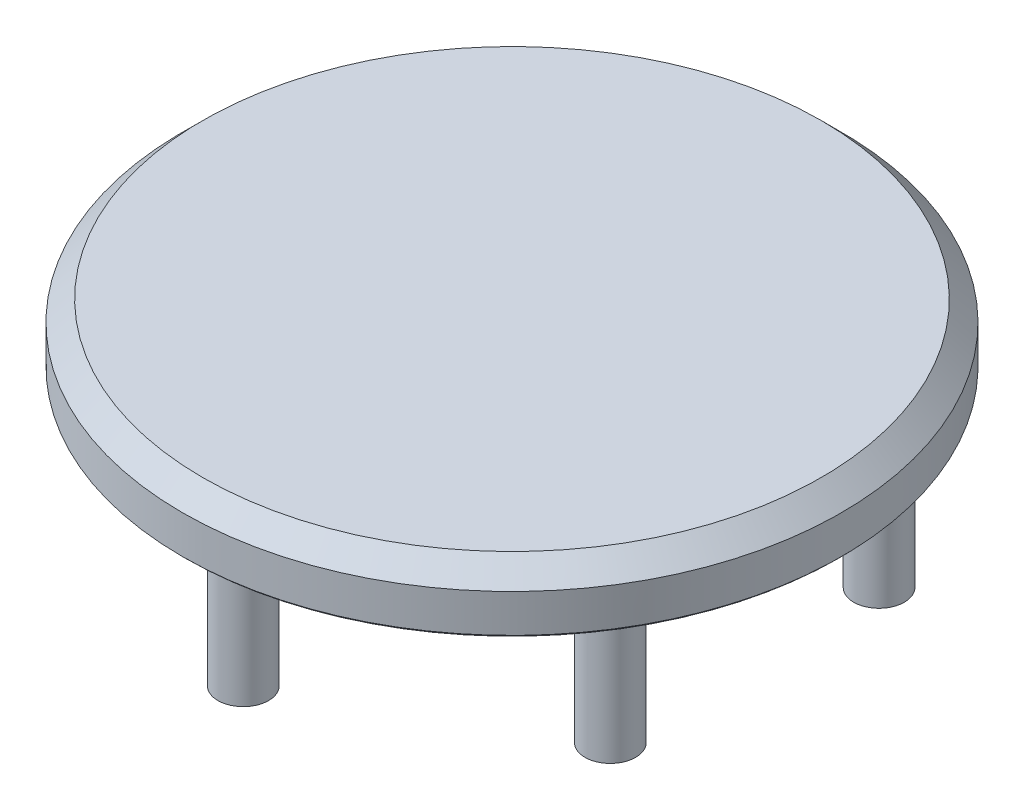
ISO-10303-21;
HEADER;
FILE_DESCRIPTION(('STEP AP214'),'2;1');
FILE_NAME('part.step','',(''),(''),'','','');
FILE_SCHEMA(('AUTOMOTIVE_DESIGN { 1 0 10303 214 1 1 1 1 }'));
ENDSEC;
DATA;
#1=APPLICATION_CONTEXT('core data for automotive mechanical design processes');
#2=APPLICATION_PROTOCOL_DEFINITION('international standard','automotive_design',2000,#1);
#3=PRODUCT_CONTEXT('',#1,'mechanical');
#4=PRODUCT('Part','Part','',(#3));
#5=PRODUCT_RELATED_PRODUCT_CATEGORY('part','',(#4));
#6=PRODUCT_DEFINITION_FORMATION('','',#4);
#7=PRODUCT_DEFINITION_CONTEXT('part definition',#1,'design');
#8=PRODUCT_DEFINITION('design','',#6,#7);
#9=PRODUCT_DEFINITION_SHAPE('','',#8);
#10=(LENGTH_UNIT() NAMED_UNIT(*) SI_UNIT(.MILLI.,.METRE.));
#11=(NAMED_UNIT(*) PLANE_ANGLE_UNIT() SI_UNIT($,.RADIAN.));
#12=(NAMED_UNIT(*) SI_UNIT($,.STERADIAN.) SOLID_ANGLE_UNIT());
#13=UNCERTAINTY_MEASURE_WITH_UNIT(LENGTH_MEASURE(1.E-05),#10,'distance_accuracy_value','');
#14=(GEOMETRIC_REPRESENTATION_CONTEXT(3) GLOBAL_UNCERTAINTY_ASSIGNED_CONTEXT((#13)) GLOBAL_UNIT_ASSIGNED_CONTEXT((#10,
#11,#12)) REPRESENTATION_CONTEXT('',''));
#15=CARTESIAN_POINT('',(0.,0.,0.));
#16=DIRECTION('',(0.,0.,1.));
#17=DIRECTION('',(1.,0.,0.));
#18=AXIS2_PLACEMENT_3D('',#15,#16,#17);
#19=CARTESIAN_POINT('',(0.,25.,0.));
#20=DIRECTION('',(0.,-1.,0.));
#21=DIRECTION('',(0.,0.,-1.));
#22=AXIS2_PLACEMENT_3D('',#19,#20,#21);
#23=PLANE('',#22);
#24=CARTESIAN_POINT('',(0.,25.,0.));
#25=DIRECTION('',(0.,-1.,0.));
#26=DIRECTION('',(0.,0.,-1.));
#27=AXIS2_PLACEMENT_3D('',#24,#25,#26);
#28=CIRCLE('',#27,32.25);
#29=CARTESIAN_POINT('',(0.,25.,-32.25));
#30=VERTEX_POINT('',#29);
#31=EDGE_CURVE('E10',#30,#30,#28,.T.);
#32=ORIENTED_EDGE('',*,*,#31,.T.);
#33=EDGE_LOOP('',(#32));
#34=FACE_BOUND('',#33,.T.);
#35=CARTESIAN_POINT('',(0.,25.,26.5));
#36=DIRECTION('',(0.,-1.,0.));
#37=DIRECTION('',(0.,0.,-1.));
#38=AXIS2_PLACEMENT_3D('',#35,#36,#37);
#39=CIRCLE('',#38,4.50000000000001);
#40=CARTESIAN_POINT('',(0.,25.,22.));
#41=VERTEX_POINT('',#40);
#42=EDGE_CURVE('E62',#41,#41,#39,.F.);
#43=ORIENTED_EDGE('',*,*,#42,.T.);
#44=EDGE_LOOP('',(#43));
#45=FACE_BOUND('',#44,.T.);
#46=CARTESIAN_POINT('',(-22.9496732002875,25.,13.2500000000003));
#47=DIRECTION('',(0.,-1.,0.));
#48=DIRECTION('',(0.,0.,-1.));
#49=AXIS2_PLACEMENT_3D('',#46,#47,#48);
#50=CIRCLE('',#49,4.49999999999999);
#51=CARTESIAN_POINT('',(-22.9496732002875,25.,8.75000000000028));
#52=VERTEX_POINT('',#51);
#53=EDGE_CURVE('E65',#52,#52,#50,.F.);
#54=ORIENTED_EDGE('',*,*,#53,.T.);
#55=EDGE_LOOP('',(#54));
#56=FACE_BOUND('',#55,.T.);
#57=CARTESIAN_POINT('',(-22.9496732002877,25.,-13.2499999999998));
#58=DIRECTION('',(0.,-1.,0.));
#59=DIRECTION('',(0.,0.,-1.));
#60=AXIS2_PLACEMENT_3D('',#57,#58,#59);
#61=CIRCLE('',#60,4.5);
#62=CARTESIAN_POINT('',(-22.9496732002877,25.,-17.7499999999998));
#63=VERTEX_POINT('',#62);
#64=EDGE_CURVE('E68',#63,#63,#61,.F.);
#65=ORIENTED_EDGE('',*,*,#64,.T.);
#66=EDGE_LOOP('',(#65));
#67=FACE_BOUND('',#66,.T.);
#68=CARTESIAN_POINT('',(0.,25.,-26.5));
#69=DIRECTION('',(0.,-1.,0.));
#70=DIRECTION('',(0.,0.,-1.));
#71=AXIS2_PLACEMENT_3D('',#68,#69,#70);
#72=CIRCLE('',#71,4.50000000000001);
#73=CARTESIAN_POINT('',(0.,25.,-31.));
#74=VERTEX_POINT('',#73);
#75=EDGE_CURVE('E71',#74,#74,#72,.F.);
#76=ORIENTED_EDGE('',*,*,#75,.T.);
#77=EDGE_LOOP('',(#76));
#78=FACE_BOUND('',#77,.T.);
#79=CARTESIAN_POINT('',(22.9496732002876,25.,-13.2500000000001));
#80=DIRECTION('',(0.,-1.,0.));
#81=DIRECTION('',(0.,0.,-1.));
#82=AXIS2_PLACEMENT_3D('',#79,#80,#81);
#83=CIRCLE('',#82,4.49999999999999);
#84=CARTESIAN_POINT('',(22.9496732002876,25.,-17.7500000000001));
#85=VERTEX_POINT('',#84);
#86=EDGE_CURVE('E74',#85,#85,#83,.F.);
#87=ORIENTED_EDGE('',*,*,#86,.T.);
#88=EDGE_LOOP('',(#87));
#89=FACE_BOUND('',#88,.T.);
#90=CARTESIAN_POINT('',(22.9496732002877,25.,13.2499999999999));
#91=DIRECTION('',(0.,-1.,0.));
#92=DIRECTION('',(0.,0.,-1.));
#93=AXIS2_PLACEMENT_3D('',#90,#91,#92);
#94=CIRCLE('',#93,4.49999999999999);
#95=CARTESIAN_POINT('',(22.9496732002877,25.,8.74999999999996));
#96=VERTEX_POINT('',#95);
#97=EDGE_CURVE('E77',#96,#96,#94,.F.);
#98=ORIENTED_EDGE('',*,*,#97,.T.);
#99=EDGE_LOOP('',(#98));
#100=FACE_BOUND('',#99,.T.);
#101=ADVANCED_FACE('F33',(#34,#45,#56,#67,#78,#89,#100),#23,.T.);
#102=CARTESIAN_POINT('',(0.,0.,0.));
#103=DIRECTION('',(0.,1.,0.));
#104=DIRECTION('',(0.,0.,1.));
#105=AXIS2_PLACEMENT_3D('',#102,#103,#104);
#106=CYLINDRICAL_SURFACE('',#105,32.5);
#107=CARTESIAN_POINT('',(0.,25.25,0.));
#108=DIRECTION('',(0.,-1.,0.));
#109=DIRECTION('',(0.,0.,-1.));
#110=AXIS2_PLACEMENT_3D('',#107,#108,#109);
#111=CIRCLE('',#110,32.5);
#112=CARTESIAN_POINT('',(0.,25.25,-32.5));
#113=VERTEX_POINT('',#112);
#114=EDGE_CURVE('E40',#113,#113,#111,.F.);
#115=ORIENTED_EDGE('',*,*,#114,.T.);
#116=EDGE_LOOP('',(#115));
#117=FACE_BOUND('',#116,.T.);
#118=CARTESIAN_POINT('',(0.,29.,0.));
#119=DIRECTION('',(0.,1.,0.));
#120=DIRECTION('',(0.,0.,1.));
#121=AXIS2_PLACEMENT_3D('',#118,#119,#120);
#122=CIRCLE('',#121,32.5);
#123=CARTESIAN_POINT('',(0.,29.,32.5));
#124=VERTEX_POINT('',#123);
#125=EDGE_CURVE('E83',#124,#124,#122,.F.);
#126=ORIENTED_EDGE('',*,*,#125,.T.);
#127=EDGE_LOOP('',(#126));
#128=FACE_BOUND('',#127,.T.);
#129=ADVANCED_FACE('F125',(#117,#128),#106,.T.);
#130=CARTESIAN_POINT('',(0.,31.,32.5));
#131=DIRECTION('',(0.,1.,0.));
#132=DIRECTION('',(0.,0.,1.));
#133=AXIS2_PLACEMENT_3D('',#130,#131,#132);
#134=PLANE('',#133);
#135=CARTESIAN_POINT('',(0.,31.,0.));
#136=DIRECTION('',(0.,1.,0.));
#137=DIRECTION('',(0.,0.,1.));
#138=AXIS2_PLACEMENT_3D('',#135,#136,#137);
#139=CIRCLE('',#138,30.5);
#140=CARTESIAN_POINT('',(0.,31.,30.5));
#141=VERTEX_POINT('',#140);
#142=EDGE_CURVE('E86',#141,#141,#139,.T.);
#143=ORIENTED_EDGE('',*,*,#142,.T.);
#144=EDGE_LOOP('',(#143));
#145=FACE_BOUND('',#144,.T.);
#146=ADVANCED_FACE('F130',(#145),#134,.T.);
#147=CARTESIAN_POINT('',(0.,31.,0.));
#148=DIRECTION('',(0.,-1.,0.));
#149=DIRECTION('',(0.,0.,-1.));
#150=AXIS2_PLACEMENT_3D('',#147,#148,#149);
#151=CONICAL_SURFACE('',#150,30.5,0.785398163397445);
#152=ORIENTED_EDGE('',*,*,#125,.F.);
#153=EDGE_LOOP('',(#152));
#154=FACE_BOUND('',#153,.T.);
#155=ORIENTED_EDGE('',*,*,#142,.F.);
#156=EDGE_LOOP('',(#155));
#157=FACE_BOUND('',#156,.T.);
#158=ADVANCED_FACE('F135',(#154,#157),#151,.T.);
#159=CARTESIAN_POINT('',(0.,4.12893218813453,26.5));
#160=DIRECTION('',(0.,1.,0.));
#161=DIRECTION('',(0.,0.,1.));
#162=AXIS2_PLACEMENT_3D('',#159,#160,#161);
#163=CYLINDRICAL_SURFACE('',#162,2.5);
#164=CARTESIAN_POINT('',(0.,23.,26.5));
#165=DIRECTION('',(0.,-1.,0.));
#166=DIRECTION('',(0.,0.,-1.));
#167=AXIS2_PLACEMENT_3D('',#164,#165,#166);
#168=CIRCLE('',#167,2.5);
#169=CARTESIAN_POINT('',(0.,23.,24.));
#170=VERTEX_POINT('',#169);
#171=EDGE_CURVE('E80',#170,#170,#168,.T.);
#172=ORIENTED_EDGE('',*,*,#171,.T.);
#173=EDGE_LOOP('',(#172));
#174=FACE_BOUND('',#173,.T.);
#175=CARTESIAN_POINT('',(0.,11.2,26.5));
#176=DIRECTION('',(0.,1.,0.));
#177=DIRECTION('',(-1.,0.,0.));
#178=AXIS2_PLACEMENT_3D('',#175,#176,#177);
#179=CIRCLE('',#178,2.5);
#180=CARTESIAN_POINT('',(-2.5,11.2,26.5));
#181=VERTEX_POINT('',#180);
#182=EDGE_CURVE('E89',#181,#181,#179,.T.);
#183=ORIENTED_EDGE('',*,*,#182,.T.);
#184=EDGE_LOOP('',(#183));
#185=FACE_BOUND('',#184,.T.);
#186=ADVANCED_FACE('F137',(#174,#185),#163,.T.);
#187=CARTESIAN_POINT('',(-32.,11.2,0.));
#188=DIRECTION('',(0.,1.,0.));
#189=DIRECTION('',(-1.,0.,0.));
#190=AXIS2_PLACEMENT_3D('',#187,#188,#189);
#191=PLANE('',#190);
#192=ORIENTED_EDGE('',*,*,#182,.F.);
#193=EDGE_LOOP('',(#192));
#194=FACE_BOUND('',#193,.T.);
#195=ADVANCED_FACE('F169',(#194),#191,.F.);
#196=CARTESIAN_POINT('',(22.9496732002877,4.12893218813453,13.2499999999999));
#197=DIRECTION('',(0.,1.,0.));
#198=DIRECTION('',(0.86602540378444,0.,0.499999999999998));
#199=AXIS2_PLACEMENT_3D('',#196,#197,#198);
#200=CYLINDRICAL_SURFACE('',#199,2.5);
#201=CARTESIAN_POINT('',(22.9496732002877,23.,13.2499999999999));
#202=DIRECTION('',(0.,-1.,0.));
#203=DIRECTION('',(0.,0.,-1.));
#204=AXIS2_PLACEMENT_3D('',#201,#202,#203);
#205=CIRCLE('',#204,2.5);
#206=CARTESIAN_POINT('',(22.9496732002877,23.,10.7499999999999));
#207=VERTEX_POINT('',#206);
#208=EDGE_CURVE('E44',#207,#207,#205,.T.);
#209=ORIENTED_EDGE('',*,*,#208,.T.);
#210=EDGE_LOOP('',(#209));
#211=FACE_BOUND('',#210,.T.);
#212=CARTESIAN_POINT('',(22.9496732002877,11.2,13.2499999999999));
#213=DIRECTION('',(0.,1.,0.));
#214=DIRECTION('',(-0.499999999999998,0.,0.86602540378444));
#215=AXIS2_PLACEMENT_3D('',#212,#213,#214);
#216=CIRCLE('',#215,2.5);
#217=CARTESIAN_POINT('',(21.6996732002877,11.2,15.415063509461));
#218=VERTEX_POINT('',#217);
#219=EDGE_CURVE('E92',#218,#218,#216,.T.);
#220=ORIENTED_EDGE('',*,*,#219,.T.);
#221=EDGE_LOOP('',(#220));
#222=FACE_BOUND('',#221,.T.);
#223=ADVANCED_FACE('F165',(#211,#222),#200,.T.);
#224=CARTESIAN_POINT('',(-15.9999999999999,11.2,27.7128129211021));
#225=DIRECTION('',(0.,1.,0.));
#226=DIRECTION('',(-0.499999999999998,0.,0.86602540378444));
#227=AXIS2_PLACEMENT_3D('',#224,#225,#226);
#228=PLANE('',#227);
#229=ORIENTED_EDGE('',*,*,#219,.F.);
#230=EDGE_LOOP('',(#229));
#231=FACE_BOUND('',#230,.T.);
#232=ADVANCED_FACE('F168',(#231),#228,.F.);
#233=CARTESIAN_POINT('',(22.9496732002876,4.12893218813453,-13.2500000000001));
#234=DIRECTION('',(0.,1.,0.));
#235=DIRECTION('',(0.866025403784436,0.,-0.500000000000004));
#236=AXIS2_PLACEMENT_3D('',#233,#234,#235);
#237=CYLINDRICAL_SURFACE('',#236,2.5);
#238=CARTESIAN_POINT('',(22.9496732002876,23.,-13.2500000000001));
#239=DIRECTION('',(0.,-1.,0.));
#240=DIRECTION('',(0.,0.,-1.));
#241=AXIS2_PLACEMENT_3D('',#238,#239,#240);
#242=CIRCLE('',#241,2.5);
#243=CARTESIAN_POINT('',(22.9496732002876,23.,-15.7500000000001));
#244=VERTEX_POINT('',#243);
#245=EDGE_CURVE('E48',#244,#244,#242,.T.);
#246=ORIENTED_EDGE('',*,*,#245,.T.);
#247=EDGE_LOOP('',(#246));
#248=FACE_BOUND('',#247,.T.);
#249=CARTESIAN_POINT('',(22.9496732002876,11.2,-13.2500000000001));
#250=DIRECTION('',(0.,1.,0.));
#251=DIRECTION('',(0.500000000000004,0.,0.866025403784436));
#252=AXIS2_PLACEMENT_3D('',#249,#250,#251);
#253=CIRCLE('',#252,2.5);
#254=CARTESIAN_POINT('',(24.1996732002876,11.2,-11.084936490539));
#255=VERTEX_POINT('',#254);
#256=EDGE_CURVE('E95',#255,#255,#253,.T.);
#257=ORIENTED_EDGE('',*,*,#256,.T.);
#258=EDGE_LOOP('',(#257));
#259=FACE_BOUND('',#258,.T.);
#260=ADVANCED_FACE('F174',(#248,#259),#237,.T.);
#261=CARTESIAN_POINT('',(16.0000000000001,11.2,27.712812921102));
#262=DIRECTION('',(0.,1.,0.));
#263=DIRECTION('',(0.500000000000004,0.,0.866025403784436));
#264=AXIS2_PLACEMENT_3D('',#261,#262,#263);
#265=PLANE('',#264);
#266=ORIENTED_EDGE('',*,*,#256,.F.);
#267=EDGE_LOOP('',(#266));
#268=FACE_BOUND('',#267,.T.);
#269=ADVANCED_FACE('F179',(#268),#265,.F.);
#270=CARTESIAN_POINT('',(0.,4.12893218813453,-26.5));
#271=DIRECTION('',(0.,1.,0.));
#272=DIRECTION('',(0.,0.,-1.));
#273=AXIS2_PLACEMENT_3D('',#270,#271,#272);
#274=CYLINDRICAL_SURFACE('',#273,2.5);
#275=CARTESIAN_POINT('',(0.,23.,-26.5));
#276=DIRECTION('',(0.,-1.,0.));
#277=DIRECTION('',(0.,0.,-1.));
#278=AXIS2_PLACEMENT_3D('',#275,#276,#277);
#279=CIRCLE('',#278,2.5);
#280=CARTESIAN_POINT('',(0.,23.,-29.));
#281=VERTEX_POINT('',#280);
#282=EDGE_CURVE('E53',#281,#281,#279,.T.);
#283=ORIENTED_EDGE('',*,*,#282,.T.);
#284=EDGE_LOOP('',(#283));
#285=FACE_BOUND('',#284,.T.);
#286=CARTESIAN_POINT('',(0.,11.2,-26.5));
#287=DIRECTION('',(0.,1.,0.));
#288=DIRECTION('',(1.,0.,0.));
#289=AXIS2_PLACEMENT_3D('',#286,#287,#288);
#290=CIRCLE('',#289,2.5);
#291=CARTESIAN_POINT('',(2.5,11.2,-26.5));
#292=VERTEX_POINT('',#291);
#293=EDGE_CURVE('E98',#292,#292,#290,.T.);
#294=ORIENTED_EDGE('',*,*,#293,.T.);
#295=EDGE_LOOP('',(#294));
#296=FACE_BOUND('',#295,.T.);
#297=ADVANCED_FACE('F227',(#285,#296),#274,.T.);
#298=CARTESIAN_POINT('',(32.,11.2,0.));
#299=DIRECTION('',(0.,1.,0.));
#300=DIRECTION('',(1.,0.,0.));
#301=AXIS2_PLACEMENT_3D('',#298,#299,#300);
#302=PLANE('',#301);
#303=ORIENTED_EDGE('',*,*,#293,.F.);
#304=EDGE_LOOP('',(#303));
#305=FACE_BOUND('',#304,.T.);
#306=ADVANCED_FACE('F232',(#305),#302,.F.);
#307=CARTESIAN_POINT('',(-22.9496732002877,4.12893218813453,-13.2499999999998));
#308=DIRECTION('',(0.,1.,0.));
#309=DIRECTION('',(-0.866025403784443,0.,-0.499999999999992));
#310=AXIS2_PLACEMENT_3D('',#307,#308,#309);
#311=CYLINDRICAL_SURFACE('',#310,2.5);
#312=CARTESIAN_POINT('',(-22.9496732002877,23.,-13.2499999999998));
#313=DIRECTION('',(0.,-1.,0.));
#314=DIRECTION('',(0.,0.,-1.));
#315=AXIS2_PLACEMENT_3D('',#312,#313,#314);
#316=CIRCLE('',#315,2.5);
#317=CARTESIAN_POINT('',(-22.9496732002877,23.,-15.7499999999998));
#318=VERTEX_POINT('',#317);
#319=EDGE_CURVE('E56',#318,#318,#316,.T.);
#320=ORIENTED_EDGE('',*,*,#319,.T.);
#321=EDGE_LOOP('',(#320));
#322=FACE_BOUND('',#321,.T.);
#323=CARTESIAN_POINT('',(-22.9496732002877,11.2,-13.2499999999998));
#324=DIRECTION('',(0.,1.,0.));
#325=DIRECTION('',(0.499999999999992,0.,-0.866025403784443));
#326=AXIS2_PLACEMENT_3D('',#323,#324,#325);
#327=CIRCLE('',#326,2.5);
#328=CARTESIAN_POINT('',(-21.6996732002878,11.2,-15.4150635094609));
#329=VERTEX_POINT('',#328);
#330=EDGE_CURVE('E101',#329,#329,#327,.T.);
#331=ORIENTED_EDGE('',*,*,#330,.T.);
#332=EDGE_LOOP('',(#331));
#333=FACE_BOUND('',#332,.T.);
#334=ADVANCED_FACE('F240',(#322,#333),#311,.T.);
#335=CARTESIAN_POINT('',(15.9999999999997,11.2,-27.7128129211022));
#336=DIRECTION('',(0.,1.,0.));
#337=DIRECTION('',(0.499999999999992,0.,-0.866025403784443));
#338=AXIS2_PLACEMENT_3D('',#335,#336,#337);
#339=PLANE('',#338);
#340=ORIENTED_EDGE('',*,*,#330,.F.);
#341=EDGE_LOOP('',(#340));
#342=FACE_BOUND('',#341,.T.);
#343=ADVANCED_FACE('F121',(#342),#339,.F.);
#344=CARTESIAN_POINT('',(-22.9496732002875,4.12893218813453,13.2500000000003));
#345=DIRECTION('',(0.,1.,0.));
#346=DIRECTION('',(-0.866025403784433,0.,0.50000000000001));
#347=AXIS2_PLACEMENT_3D('',#344,#345,#346);
#348=CYLINDRICAL_SURFACE('',#347,2.5);
#349=CARTESIAN_POINT('',(-22.9496732002875,23.,13.2500000000003));
#350=DIRECTION('',(0.,-1.,0.));
#351=DIRECTION('',(0.,0.,-1.));
#352=AXIS2_PLACEMENT_3D('',#349,#350,#351);
#353=CIRCLE('',#352,2.5);
#354=CARTESIAN_POINT('',(-22.9496732002875,23.,10.7500000000003));
#355=VERTEX_POINT('',#354);
#356=EDGE_CURVE('E59',#355,#355,#353,.T.);
#357=ORIENTED_EDGE('',*,*,#356,.T.);
#358=EDGE_LOOP('',(#357));
#359=FACE_BOUND('',#358,.T.);
#360=CARTESIAN_POINT('',(-22.9496732002875,11.2,13.2500000000003));
#361=DIRECTION('',(0.,1.,0.));
#362=DIRECTION('',(-0.50000000000001,0.,-0.866025403784433));
#363=AXIS2_PLACEMENT_3D('',#360,#361,#362);
#364=CIRCLE('',#363,2.5);
#365=CARTESIAN_POINT('',(-24.1996732002875,11.2,11.0849364905392));
#366=VERTEX_POINT('',#365);
#367=EDGE_CURVE('E104',#366,#366,#364,.T.);
#368=ORIENTED_EDGE('',*,*,#367,.T.);
#369=EDGE_LOOP('',(#368));
#370=FACE_BOUND('',#369,.T.);
#371=ADVANCED_FACE('F108',(#359,#370),#348,.T.);
#372=CARTESIAN_POINT('',(-16.0000000000003,11.2,-27.7128129211019));
#373=DIRECTION('',(0.,1.,0.));
#374=DIRECTION('',(-0.50000000000001,0.,-0.866025403784433));
#375=AXIS2_PLACEMENT_3D('',#372,#373,#374);
#376=PLANE('',#375);
#377=ORIENTED_EDGE('',*,*,#367,.F.);
#378=EDGE_LOOP('',(#377));
#379=FACE_BOUND('',#378,.T.);
#380=ADVANCED_FACE('F110',(#379),#376,.F.);
#381=CARTESIAN_POINT('',(0.,23.,26.5));
#382=DIRECTION('',(0.,1.,0.));
#383=DIRECTION('',(0.,0.,1.));
#384=AXIS2_PLACEMENT_3D('',#381,#382,#383);
#385=CONICAL_SURFACE('',#384,2.5,0.785398163397445);
#386=ORIENTED_EDGE('',*,*,#42,.F.);
#387=EDGE_LOOP('',(#386));
#388=FACE_BOUND('',#387,.T.);
#389=ORIENTED_EDGE('',*,*,#171,.F.);
#390=EDGE_LOOP('',(#389));
#391=FACE_BOUND('',#390,.T.);
#392=ADVANCED_FACE('F112',(#388,#391),#385,.T.);
#393=CARTESIAN_POINT('',(-22.9496732002875,23.,13.2500000000003));
#394=DIRECTION('',(0.,1.,0.));
#395=DIRECTION('',(0.,0.,1.));
#396=AXIS2_PLACEMENT_3D('',#393,#394,#395);
#397=CONICAL_SURFACE('',#396,2.5,0.78539816339744);
#398=ORIENTED_EDGE('',*,*,#53,.F.);
#399=EDGE_LOOP('',(#398));
#400=FACE_BOUND('',#399,.T.);
#401=ORIENTED_EDGE('',*,*,#356,.F.);
#402=EDGE_LOOP('',(#401));
#403=FACE_BOUND('',#402,.T.);
#404=ADVANCED_FACE('F118',(#400,#403),#397,.T.);
#405=CARTESIAN_POINT('',(-22.9496732002877,23.,-13.2499999999998));
#406=DIRECTION('',(0.,1.,0.));
#407=DIRECTION('',(0.,0.,1.));
#408=AXIS2_PLACEMENT_3D('',#405,#406,#407);
#409=CONICAL_SURFACE('',#408,2.5,0.785398163397444);
#410=ORIENTED_EDGE('',*,*,#64,.F.);
#411=EDGE_LOOP('',(#410));
#412=FACE_BOUND('',#411,.T.);
#413=ORIENTED_EDGE('',*,*,#319,.F.);
#414=EDGE_LOOP('',(#413));
#415=FACE_BOUND('',#414,.T.);
#416=ADVANCED_FACE('F142',(#412,#415),#409,.T.);
#417=CARTESIAN_POINT('',(0.,23.,-26.5));
#418=DIRECTION('',(0.,1.,0.));
#419=DIRECTION('',(0.,0.,1.));
#420=AXIS2_PLACEMENT_3D('',#417,#418,#419);
#421=CONICAL_SURFACE('',#420,2.5,0.785398163397445);
#422=ORIENTED_EDGE('',*,*,#75,.F.);
#423=EDGE_LOOP('',(#422));
#424=FACE_BOUND('',#423,.T.);
#425=ORIENTED_EDGE('',*,*,#282,.F.);
#426=EDGE_LOOP('',(#425));
#427=FACE_BOUND('',#426,.T.);
#428=ADVANCED_FACE('F146',(#424,#427),#421,.T.);
#429=CARTESIAN_POINT('',(22.9496732002876,23.,-13.2500000000001));
#430=DIRECTION('',(0.,1.,0.));
#431=DIRECTION('',(0.,0.,1.));
#432=AXIS2_PLACEMENT_3D('',#429,#430,#431);
#433=CONICAL_SURFACE('',#432,2.5,0.785398163397443);
#434=ORIENTED_EDGE('',*,*,#86,.F.);
#435=EDGE_LOOP('',(#434));
#436=FACE_BOUND('',#435,.T.);
#437=ORIENTED_EDGE('',*,*,#245,.F.);
#438=EDGE_LOOP('',(#437));
#439=FACE_BOUND('',#438,.T.);
#440=ADVANCED_FACE('F150',(#436,#439),#433,.T.);
#441=CARTESIAN_POINT('',(22.9496732002877,23.,13.2499999999999));
#442=DIRECTION('',(0.,1.,0.));
#443=DIRECTION('',(0.,0.,1.));
#444=AXIS2_PLACEMENT_3D('',#441,#442,#443);
#445=CONICAL_SURFACE('',#444,2.5,0.785398163397441);
#446=ORIENTED_EDGE('',*,*,#97,.F.);
#447=EDGE_LOOP('',(#446));
#448=FACE_BOUND('',#447,.T.);
#449=ORIENTED_EDGE('',*,*,#208,.F.);
#450=EDGE_LOOP('',(#449));
#451=FACE_BOUND('',#450,.T.);
#452=ADVANCED_FACE('F153',(#448,#451),#445,.T.);
#453=CARTESIAN_POINT('',(0.,25.25,0.));
#454=DIRECTION('',(0.,1.,0.));
#455=DIRECTION('',(0.,0.,1.));
#456=AXIS2_PLACEMENT_3D('',#453,#454,#455);
#457=CONICAL_SURFACE('',#456,32.5,0.785398163397435);
#458=ORIENTED_EDGE('',*,*,#31,.F.);
#459=EDGE_LOOP('',(#458));
#460=FACE_BOUND('',#459,.T.);
#461=ORIENTED_EDGE('',*,*,#114,.F.);
#462=EDGE_LOOP('',(#461));
#463=FACE_BOUND('',#462,.T.);
#464=ADVANCED_FACE('F35',(#460,#463),#457,.T.);
#465=CLOSED_SHELL('',(#101,#129,#146,#158,#186,#195,#223,#232,#260,#269,#297,#306,#334,#343,
#371,#380,#392,#404,#416,#428,#440,#452,#464));
#466=MANIFOLD_SOLID_BREP('B2',#465);
#467=ADVANCED_BREP_SHAPE_REPRESENTATION('',(#18,#466),#14);
#468=SHAPE_DEFINITION_REPRESENTATION(#9,#467);
ENDSEC;
END-ISO-10303-21;
